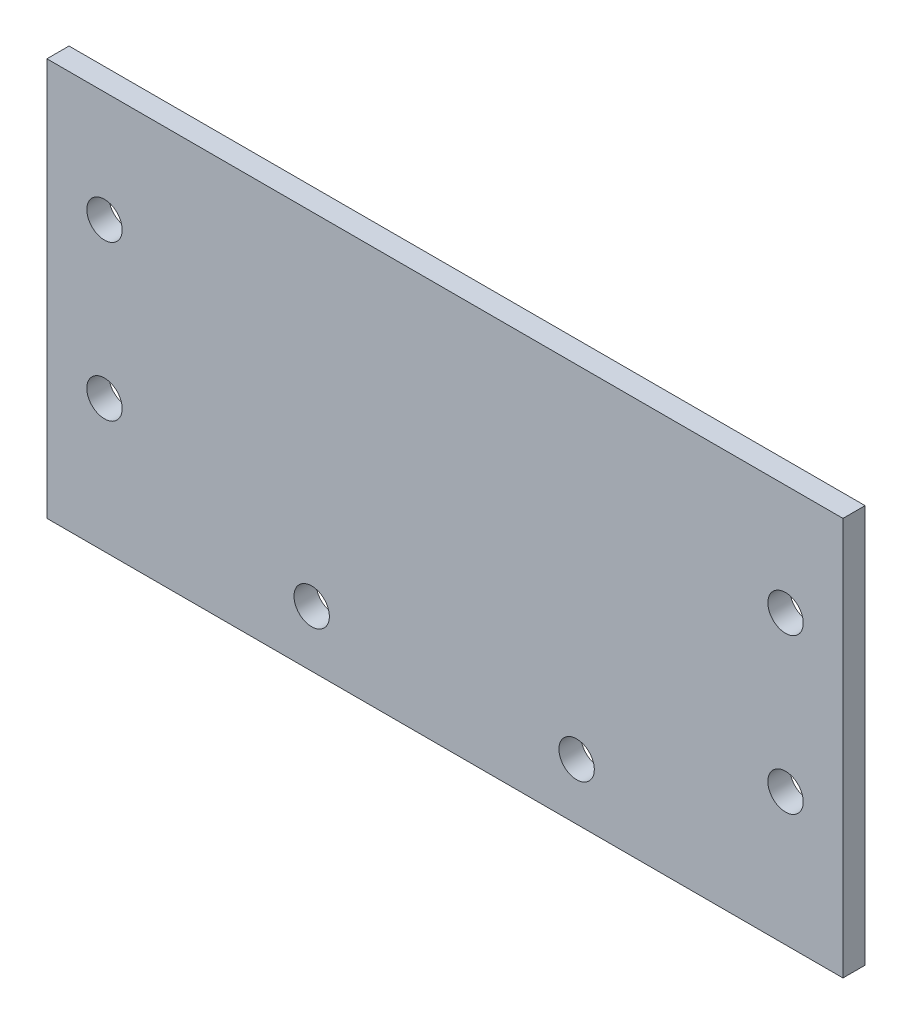
ISO-10303-21;
HEADER;
FILE_DESCRIPTION(('STEP AP214'),'2;1');
FILE_NAME('part.step','',(''),(''),'','','');
FILE_SCHEMA(('AUTOMOTIVE_DESIGN { 1 0 10303 214 1 1 1 1 }'));
ENDSEC;
DATA;
#1=APPLICATION_CONTEXT('core data for automotive mechanical design processes');
#2=APPLICATION_PROTOCOL_DEFINITION('international standard','automotive_design',2000,#1);
#3=PRODUCT_CONTEXT('',#1,'mechanical');
#4=PRODUCT('Part','Part','',(#3));
#5=PRODUCT_RELATED_PRODUCT_CATEGORY('part','',(#4));
#6=PRODUCT_DEFINITION_FORMATION('','',#4);
#7=PRODUCT_DEFINITION_CONTEXT('part definition',#1,'design');
#8=PRODUCT_DEFINITION('design','',#6,#7);
#9=PRODUCT_DEFINITION_SHAPE('','',#8);
#10=(LENGTH_UNIT() NAMED_UNIT(*) SI_UNIT(.MILLI.,.METRE.));
#11=(NAMED_UNIT(*) PLANE_ANGLE_UNIT() SI_UNIT($,.RADIAN.));
#12=(NAMED_UNIT(*) SI_UNIT($,.STERADIAN.) SOLID_ANGLE_UNIT());
#13=UNCERTAINTY_MEASURE_WITH_UNIT(LENGTH_MEASURE(1.E-05),#10,'distance_accuracy_value','');
#14=(GEOMETRIC_REPRESENTATION_CONTEXT(3) GLOBAL_UNCERTAINTY_ASSIGNED_CONTEXT((#13)) GLOBAL_UNIT_ASSIGNED_CONTEXT((#10,
#11,#12)) REPRESENTATION_CONTEXT('',''));
#15=CARTESIAN_POINT('',(0.,0.,0.));
#16=DIRECTION('',(0.,0.,1.));
#17=DIRECTION('',(1.,0.,0.));
#18=AXIS2_PLACEMENT_3D('',#15,#16,#17);
#19=CARTESIAN_POINT('',(0.,0.,5.));
#20=DIRECTION('',(-1.,0.,0.));
#21=DIRECTION('',(0.,0.,1.));
#22=AXIS2_PLACEMENT_3D('',#19,#20,#21);
#23=PLANE('',#22);
#24=DIRECTION('',(0.,1.,0.));
#25=VECTOR('',#24,1.);
#26=CARTESIAN_POINT('',(0.,0.,0.));
#27=LINE('',#26,#25);
#28=CARTESIAN_POINT('',(0.,0.,0.));
#29=VERTEX_POINT('',#28);
#30=CARTESIAN_POINT('',(0.,90.,0.));
#31=VERTEX_POINT('',#30);
#32=EDGE_CURVE('E104',#29,#31,#27,.T.);
#33=ORIENTED_EDGE('',*,*,#32,.F.);
#34=DIRECTION('',(0.,0.,-1.));
#35=VECTOR('',#34,1.);
#36=CARTESIAN_POINT('',(0.,0.,5.));
#37=LINE('',#36,#35);
#38=CARTESIAN_POINT('',(0.,0.,5.));
#39=VERTEX_POINT('',#38);
#40=EDGE_CURVE('E11',#39,#29,#37,.T.);
#41=ORIENTED_EDGE('',*,*,#40,.F.);
#42=DIRECTION('',(0.,1.,0.));
#43=VECTOR('',#42,1.);
#44=CARTESIAN_POINT('',(0.,0.,5.));
#45=LINE('',#44,#43);
#46=CARTESIAN_POINT('',(0.,90.,5.));
#47=VERTEX_POINT('',#46);
#48=EDGE_CURVE('E97',#39,#47,#45,.T.);
#49=ORIENTED_EDGE('',*,*,#48,.T.);
#50=DIRECTION('',(0.,0.,-1.));
#51=VECTOR('',#50,1.);
#52=CARTESIAN_POINT('',(0.,90.,5.));
#53=LINE('',#52,#51);
#54=EDGE_CURVE('E45',#47,#31,#53,.T.);
#55=ORIENTED_EDGE('',*,*,#54,.T.);
#56=EDGE_LOOP('',(#33,#41,#49,#55));
#57=FACE_BOUND('',#56,.T.);
#58=ADVANCED_FACE('F39',(#57),#23,.T.);
#59=CARTESIAN_POINT('',(0.,0.,5.));
#60=DIRECTION('',(0.,1.,0.));
#61=DIRECTION('',(0.,0.,1.));
#62=AXIS2_PLACEMENT_3D('',#59,#60,#61);
#63=PLANE('',#62);
#64=DIRECTION('',(1.,0.,0.));
#65=VECTOR('',#64,1.);
#66=CARTESIAN_POINT('',(0.,0.,0.));
#67=LINE('',#66,#65);
#68=CARTESIAN_POINT('',(180.,0.,0.));
#69=VERTEX_POINT('',#68);
#70=EDGE_CURVE('E75',#29,#69,#67,.T.);
#71=ORIENTED_EDGE('',*,*,#70,.T.);
#72=DIRECTION('',(0.,0.,-1.));
#73=VECTOR('',#72,1.);
#74=CARTESIAN_POINT('',(180.,0.,5.));
#75=LINE('',#74,#73);
#76=CARTESIAN_POINT('',(180.,0.,5.));
#77=VERTEX_POINT('',#76);
#78=EDGE_CURVE('E48',#77,#69,#75,.T.);
#79=ORIENTED_EDGE('',*,*,#78,.F.);
#80=DIRECTION('',(1.,0.,0.));
#81=VECTOR('',#80,1.);
#82=CARTESIAN_POINT('',(0.,0.,5.));
#83=LINE('',#82,#81);
#84=EDGE_CURVE('E90',#39,#77,#83,.T.);
#85=ORIENTED_EDGE('',*,*,#84,.F.);
#86=ORIENTED_EDGE('',*,*,#40,.T.);
#87=EDGE_LOOP('',(#71,#79,#85,#86));
#88=FACE_BOUND('',#87,.T.);
#89=ADVANCED_FACE('F117',(#88),#63,.F.);
#90=CARTESIAN_POINT('',(180.,0.,5.));
#91=DIRECTION('',(-1.,0.,0.));
#92=DIRECTION('',(0.,0.,1.));
#93=AXIS2_PLACEMENT_3D('',#90,#91,#92);
#94=PLANE('',#93);
#95=DIRECTION('',(0.,1.,0.));
#96=VECTOR('',#95,1.);
#97=CARTESIAN_POINT('',(180.,0.,0.));
#98=LINE('',#97,#96);
#99=CARTESIAN_POINT('',(180.,90.,0.));
#100=VERTEX_POINT('',#99);
#101=EDGE_CURVE('E96',#69,#100,#98,.T.);
#102=ORIENTED_EDGE('',*,*,#101,.T.);
#103=DIRECTION('',(0.,0.,-1.));
#104=VECTOR('',#103,1.);
#105=CARTESIAN_POINT('',(180.,90.,5.));
#106=LINE('',#105,#104);
#107=CARTESIAN_POINT('',(180.,90.,5.));
#108=VERTEX_POINT('',#107);
#109=EDGE_CURVE('E91',#108,#100,#106,.T.);
#110=ORIENTED_EDGE('',*,*,#109,.F.);
#111=DIRECTION('',(0.,1.,0.));
#112=VECTOR('',#111,1.);
#113=CARTESIAN_POINT('',(180.,0.,5.));
#114=LINE('',#113,#112);
#115=EDGE_CURVE('E84',#77,#108,#114,.T.);
#116=ORIENTED_EDGE('',*,*,#115,.F.);
#117=ORIENTED_EDGE('',*,*,#78,.T.);
#118=EDGE_LOOP('',(#102,#110,#116,#117));
#119=FACE_BOUND('',#118,.T.);
#120=ADVANCED_FACE('F94',(#119),#94,.F.);
#121=CARTESIAN_POINT('',(0.,90.,5.));
#122=DIRECTION('',(0.,1.,0.));
#123=DIRECTION('',(0.,0.,1.));
#124=AXIS2_PLACEMENT_3D('',#121,#122,#123);
#125=PLANE('',#124);
#126=DIRECTION('',(1.,0.,0.));
#127=VECTOR('',#126,1.);
#128=CARTESIAN_POINT('',(0.,90.,0.));
#129=LINE('',#128,#127);
#130=EDGE_CURVE('E107',#31,#100,#129,.T.);
#131=ORIENTED_EDGE('',*,*,#130,.F.);
#132=ORIENTED_EDGE('',*,*,#54,.F.);
#133=DIRECTION('',(1.,0.,0.));
#134=VECTOR('',#133,1.);
#135=CARTESIAN_POINT('',(0.,90.,5.));
#136=LINE('',#135,#134);
#137=EDGE_CURVE('E86',#47,#108,#136,.T.);
#138=ORIENTED_EDGE('',*,*,#137,.T.);
#139=ORIENTED_EDGE('',*,*,#109,.T.);
#140=EDGE_LOOP('',(#131,#132,#138,#139));
#141=FACE_BOUND('',#140,.T.);
#142=ADVANCED_FACE('F98',(#141),#125,.T.);
#143=CARTESIAN_POINT('',(0.,0.,5.));
#144=DIRECTION('',(0.,0.,-1.));
#145=DIRECTION('',(-1.,0.,0.));
#146=AXIS2_PLACEMENT_3D('',#143,#144,#145);
#147=PLANE('',#146);
#148=CARTESIAN_POINT('',(119.774053648556,12.7161710916681,5.));
#149=DIRECTION('',(0.,0.,1.));
#150=DIRECTION('',(1.,0.,0.));
#151=AXIS2_PLACEMENT_3D('',#148,#149,#150);
#152=CIRCLE('',#151,3.99999999999999);
#153=CARTESIAN_POINT('',(123.774053648556,12.7161710916681,5.));
#154=VERTEX_POINT('',#153);
#155=EDGE_CURVE('E166',#154,#154,#152,.T.);
#156=ORIENTED_EDGE('',*,*,#155,.F.);
#157=EDGE_LOOP('',(#156));
#158=FACE_BOUND('',#157,.T.);
#159=CARTESIAN_POINT('',(59.8660862114939,12.7161710916681,5.));
#160=DIRECTION('',(0.,0.,1.));
#161=DIRECTION('',(1.,0.,0.));
#162=AXIS2_PLACEMENT_3D('',#159,#160,#161);
#163=CIRCLE('',#162,3.99999999999999);
#164=CARTESIAN_POINT('',(63.8660862114939,12.7161710916681,5.));
#165=VERTEX_POINT('',#164);
#166=EDGE_CURVE('E172',#165,#165,#163,.T.);
#167=ORIENTED_EDGE('',*,*,#166,.F.);
#168=EDGE_LOOP('',(#167));
#169=FACE_BOUND('',#168,.T.);
#170=CARTESIAN_POINT('',(13.0181822337666,29.9980201948637,5.));
#171=DIRECTION('',(0.,0.,1.));
#172=DIRECTION('',(1.,0.,0.));
#173=AXIS2_PLACEMENT_3D('',#170,#171,#172);
#174=CIRCLE('',#173,3.99999999999999);
#175=CARTESIAN_POINT('',(17.0181822337665,29.9980201948637,5.));
#176=VERTEX_POINT('',#175);
#177=EDGE_CURVE('E179',#176,#176,#174,.T.);
#178=ORIENTED_EDGE('',*,*,#177,.F.);
#179=EDGE_LOOP('',(#178));
#180=FACE_BOUND('',#179,.T.);
#181=CARTESIAN_POINT('',(13.0181822337666,64.9973789483533,5.));
#182=DIRECTION('',(0.,0.,1.));
#183=DIRECTION('',(1.,0.,0.));
#184=AXIS2_PLACEMENT_3D('',#181,#182,#183);
#185=CIRCLE('',#184,3.99999999999999);
#186=CARTESIAN_POINT('',(17.0181822337665,64.9973789483533,5.));
#187=VERTEX_POINT('',#186);
#188=EDGE_CURVE('E183',#187,#187,#185,.T.);
#189=ORIENTED_EDGE('',*,*,#188,.F.);
#190=EDGE_LOOP('',(#189));
#191=FACE_BOUND('',#190,.T.);
#192=CARTESIAN_POINT('',(167.014835526852,64.9973789483533,5.));
#193=DIRECTION('',(0.,0.,1.));
#194=DIRECTION('',(1.,0.,0.));
#195=AXIS2_PLACEMENT_3D('',#192,#193,#194);
#196=CIRCLE('',#195,3.99999999999998);
#197=CARTESIAN_POINT('',(171.014835526852,64.9973789483533,5.));
#198=VERTEX_POINT('',#197);
#199=EDGE_CURVE('E192',#198,#198,#196,.T.);
#200=ORIENTED_EDGE('',*,*,#199,.F.);
#201=EDGE_LOOP('',(#200));
#202=FACE_BOUND('',#201,.T.);
#203=CARTESIAN_POINT('',(167.014835526852,29.9980201948637,5.));
#204=DIRECTION('',(0.,0.,1.));
#205=DIRECTION('',(1.,0.,0.));
#206=AXIS2_PLACEMENT_3D('',#203,#204,#205);
#207=CIRCLE('',#206,3.99999999999998);
#208=CARTESIAN_POINT('',(171.014835526852,29.9980201948637,5.));
#209=VERTEX_POINT('',#208);
#210=EDGE_CURVE('E197',#209,#209,#207,.T.);
#211=ORIENTED_EDGE('',*,*,#210,.F.);
#212=EDGE_LOOP('',(#211));
#213=FACE_BOUND('',#212,.T.);
#214=ORIENTED_EDGE('',*,*,#48,.F.);
#215=ORIENTED_EDGE('',*,*,#84,.T.);
#216=ORIENTED_EDGE('',*,*,#115,.T.);
#217=ORIENTED_EDGE('',*,*,#137,.F.);
#218=EDGE_LOOP('',(#214,#215,#216,#217));
#219=FACE_BOUND('',#218,.T.);
#220=ADVANCED_FACE('F87',(#158,#169,#180,#191,#202,#213,#219),#147,.F.);
#221=CARTESIAN_POINT('',(0.,0.,0.));
#222=DIRECTION('',(0.,0.,-1.));
#223=DIRECTION('',(-1.,0.,0.));
#224=AXIS2_PLACEMENT_3D('',#221,#222,#223);
#225=PLANE('',#224);
#226=CARTESIAN_POINT('',(119.774053648556,12.7161710916681,0.));
#227=DIRECTION('',(0.,0.,1.));
#228=DIRECTION('',(1.,0.,0.));
#229=AXIS2_PLACEMENT_3D('',#226,#227,#228);
#230=CIRCLE('',#229,3.99999999999999);
#231=CARTESIAN_POINT('',(123.774053648556,12.7161710916681,0.));
#232=VERTEX_POINT('',#231);
#233=EDGE_CURVE('E170',#232,#232,#230,.T.);
#234=ORIENTED_EDGE('',*,*,#233,.T.);
#235=EDGE_LOOP('',(#234));
#236=FACE_BOUND('',#235,.T.);
#237=CARTESIAN_POINT('',(59.8660862114939,12.7161710916681,0.));
#238=DIRECTION('',(0.,0.,1.));
#239=DIRECTION('',(1.,0.,0.));
#240=AXIS2_PLACEMENT_3D('',#237,#238,#239);
#241=CIRCLE('',#240,3.99999999999999);
#242=CARTESIAN_POINT('',(63.8660862114939,12.7161710916681,0.));
#243=VERTEX_POINT('',#242);
#244=EDGE_CURVE('E177',#243,#243,#241,.T.);
#245=ORIENTED_EDGE('',*,*,#244,.T.);
#246=EDGE_LOOP('',(#245));
#247=FACE_BOUND('',#246,.T.);
#248=CARTESIAN_POINT('',(13.0181822337666,29.9980201948637,0.));
#249=DIRECTION('',(0.,0.,1.));
#250=DIRECTION('',(1.,0.,0.));
#251=AXIS2_PLACEMENT_3D('',#248,#249,#250);
#252=CIRCLE('',#251,3.99999999999999);
#253=CARTESIAN_POINT('',(17.0181822337665,29.9980201948637,0.));
#254=VERTEX_POINT('',#253);
#255=EDGE_CURVE('E185',#254,#254,#252,.T.);
#256=ORIENTED_EDGE('',*,*,#255,.T.);
#257=EDGE_LOOP('',(#256));
#258=FACE_BOUND('',#257,.T.);
#259=CARTESIAN_POINT('',(13.0181822337666,64.9973789483533,0.));
#260=DIRECTION('',(0.,0.,1.));
#261=DIRECTION('',(1.,0.,0.));
#262=AXIS2_PLACEMENT_3D('',#259,#260,#261);
#263=CIRCLE('',#262,3.99999999999999);
#264=CARTESIAN_POINT('',(17.0181822337665,64.9973789483533,0.));
#265=VERTEX_POINT('',#264);
#266=EDGE_CURVE('E189',#265,#265,#263,.T.);
#267=ORIENTED_EDGE('',*,*,#266,.T.);
#268=EDGE_LOOP('',(#267));
#269=FACE_BOUND('',#268,.T.);
#270=CARTESIAN_POINT('',(167.014835526852,64.9973789483533,0.));
#271=DIRECTION('',(0.,0.,1.));
#272=DIRECTION('',(1.,0.,0.));
#273=AXIS2_PLACEMENT_3D('',#270,#271,#272);
#274=CIRCLE('',#273,3.99999999999998);
#275=CARTESIAN_POINT('',(171.014835526852,64.9973789483533,0.));
#276=VERTEX_POINT('',#275);
#277=EDGE_CURVE('E194',#276,#276,#274,.T.);
#278=ORIENTED_EDGE('',*,*,#277,.T.);
#279=EDGE_LOOP('',(#278));
#280=FACE_BOUND('',#279,.T.);
#281=CARTESIAN_POINT('',(167.014835526852,29.9980201948637,0.));
#282=DIRECTION('',(0.,0.,1.));
#283=DIRECTION('',(1.,0.,0.));
#284=AXIS2_PLACEMENT_3D('',#281,#282,#283);
#285=CIRCLE('',#284,3.99999999999998);
#286=CARTESIAN_POINT('',(171.014835526852,29.9980201948637,0.));
#287=VERTEX_POINT('',#286);
#288=EDGE_CURVE('E108',#287,#287,#285,.T.);
#289=ORIENTED_EDGE('',*,*,#288,.T.);
#290=EDGE_LOOP('',(#289));
#291=FACE_BOUND('',#290,.T.);
#292=ORIENTED_EDGE('',*,*,#32,.T.);
#293=ORIENTED_EDGE('',*,*,#130,.T.);
#294=ORIENTED_EDGE('',*,*,#101,.F.);
#295=ORIENTED_EDGE('',*,*,#70,.F.);
#296=EDGE_LOOP('',(#292,#293,#294,#295));
#297=FACE_BOUND('',#296,.T.);
#298=ADVANCED_FACE('F111',(#236,#247,#258,#269,#280,#291,#297),#225,.T.);
#299=CARTESIAN_POINT('',(167.014835526852,29.9980201948637,5.));
#300=DIRECTION('',(0.,0.,1.));
#301=DIRECTION('',(1.,0.,0.));
#302=AXIS2_PLACEMENT_3D('',#299,#300,#301);
#303=CYLINDRICAL_SURFACE('',#302,3.99999999999998);
#304=ORIENTED_EDGE('',*,*,#288,.F.);
#305=EDGE_LOOP('',(#304));
#306=FACE_BOUND('',#305,.T.);
#307=ORIENTED_EDGE('',*,*,#210,.T.);
#308=EDGE_LOOP('',(#307));
#309=FACE_BOUND('',#308,.T.);
#310=ADVANCED_FACE('F133',(#306,#309),#303,.F.);
#311=CARTESIAN_POINT('',(167.014835526852,64.9973789483533,5.));
#312=DIRECTION('',(0.,0.,1.));
#313=DIRECTION('',(1.,0.,0.));
#314=AXIS2_PLACEMENT_3D('',#311,#312,#313);
#315=CYLINDRICAL_SURFACE('',#314,3.99999999999998);
#316=ORIENTED_EDGE('',*,*,#277,.F.);
#317=EDGE_LOOP('',(#316));
#318=FACE_BOUND('',#317,.T.);
#319=ORIENTED_EDGE('',*,*,#199,.T.);
#320=EDGE_LOOP('',(#319));
#321=FACE_BOUND('',#320,.T.);
#322=ADVANCED_FACE('F142',(#318,#321),#315,.F.);
#323=CARTESIAN_POINT('',(13.0181822337666,64.9973789483533,5.));
#324=DIRECTION('',(0.,0.,1.));
#325=DIRECTION('',(1.,0.,0.));
#326=AXIS2_PLACEMENT_3D('',#323,#324,#325);
#327=CYLINDRICAL_SURFACE('',#326,3.99999999999999);
#328=ORIENTED_EDGE('',*,*,#266,.F.);
#329=EDGE_LOOP('',(#328));
#330=FACE_BOUND('',#329,.T.);
#331=ORIENTED_EDGE('',*,*,#188,.T.);
#332=EDGE_LOOP('',(#331));
#333=FACE_BOUND('',#332,.T.);
#334=ADVANCED_FACE('F148',(#330,#333),#327,.F.);
#335=CARTESIAN_POINT('',(13.0181822337666,29.9980201948637,5.));
#336=DIRECTION('',(0.,0.,1.));
#337=DIRECTION('',(1.,0.,0.));
#338=AXIS2_PLACEMENT_3D('',#335,#336,#337);
#339=CYLINDRICAL_SURFACE('',#338,3.99999999999999);
#340=ORIENTED_EDGE('',*,*,#255,.F.);
#341=EDGE_LOOP('',(#340));
#342=FACE_BOUND('',#341,.T.);
#343=ORIENTED_EDGE('',*,*,#177,.T.);
#344=EDGE_LOOP('',(#343));
#345=FACE_BOUND('',#344,.T.);
#346=ADVANCED_FACE('F147',(#342,#345),#339,.F.);
#347=CARTESIAN_POINT('',(59.8660862114939,12.7161710916681,5.));
#348=DIRECTION('',(0.,0.,1.));
#349=DIRECTION('',(1.,0.,0.));
#350=AXIS2_PLACEMENT_3D('',#347,#348,#349);
#351=CYLINDRICAL_SURFACE('',#350,3.99999999999999);
#352=ORIENTED_EDGE('',*,*,#244,.F.);
#353=EDGE_LOOP('',(#352));
#354=FACE_BOUND('',#353,.T.);
#355=ORIENTED_EDGE('',*,*,#166,.T.);
#356=EDGE_LOOP('',(#355));
#357=FACE_BOUND('',#356,.T.);
#358=ADVANCED_FACE('F152',(#354,#357),#351,.F.);
#359=CARTESIAN_POINT('',(119.774053648556,12.7161710916681,5.));
#360=DIRECTION('',(0.,0.,1.));
#361=DIRECTION('',(1.,0.,0.));
#362=AXIS2_PLACEMENT_3D('',#359,#360,#361);
#363=CYLINDRICAL_SURFACE('',#362,3.99999999999999);
#364=ORIENTED_EDGE('',*,*,#233,.F.);
#365=EDGE_LOOP('',(#364));
#366=FACE_BOUND('',#365,.T.);
#367=ORIENTED_EDGE('',*,*,#155,.T.);
#368=EDGE_LOOP('',(#367));
#369=FACE_BOUND('',#368,.T.);
#370=ADVANCED_FACE('F158',(#366,#369),#363,.F.);
#371=CLOSED_SHELL('',(#58,#89,#120,#142,#220,#298,#310,#322,#334,#346,#358,#370));
#372=MANIFOLD_SOLID_BREP('B2',#371);
#373=ADVANCED_BREP_SHAPE_REPRESENTATION('',(#18,#372),#14);
#374=SHAPE_DEFINITION_REPRESENTATION(#9,#373);
ENDSEC;
END-ISO-10303-21;
